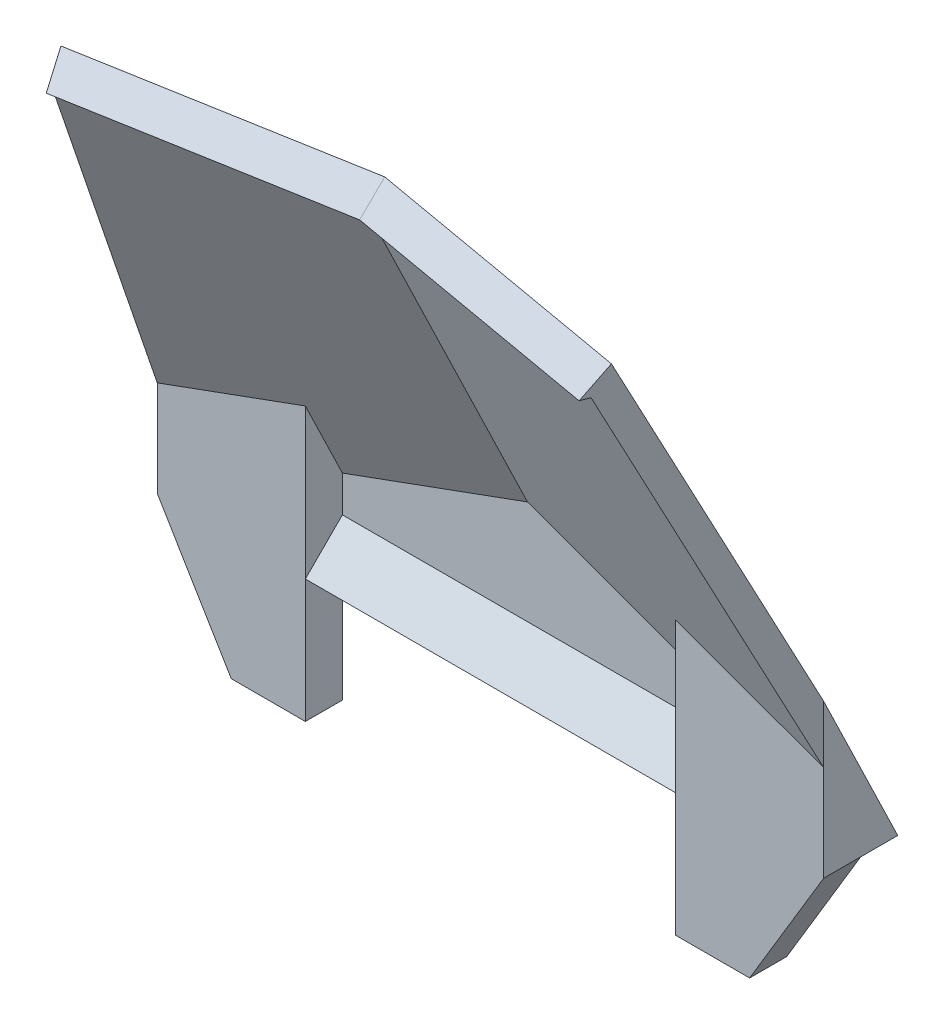
ISO-10303-21;
HEADER;
FILE_DESCRIPTION(('STEP AP214'),'2;1');
FILE_NAME('part.step','',(''),(''),'','','');
FILE_SCHEMA(('AUTOMOTIVE_DESIGN { 1 0 10303 214 1 1 1 1 }'));
ENDSEC;
DATA;
#1=APPLICATION_CONTEXT('core data for automotive mechanical design processes');
#2=APPLICATION_PROTOCOL_DEFINITION('international standard','automotive_design',2000,#1);
#3=PRODUCT_CONTEXT('',#1,'mechanical');
#4=PRODUCT('Part','Part','',(#3));
#5=PRODUCT_RELATED_PRODUCT_CATEGORY('part','',(#4));
#6=PRODUCT_DEFINITION_FORMATION('','',#4);
#7=PRODUCT_DEFINITION_CONTEXT('part definition',#1,'design');
#8=PRODUCT_DEFINITION('design','',#6,#7);
#9=PRODUCT_DEFINITION_SHAPE('','',#8);
#10=(LENGTH_UNIT() NAMED_UNIT(*) SI_UNIT(.MILLI.,.METRE.));
#11=(NAMED_UNIT(*) PLANE_ANGLE_UNIT() SI_UNIT($,.RADIAN.));
#12=(NAMED_UNIT(*) SI_UNIT($,.STERADIAN.) SOLID_ANGLE_UNIT());
#13=UNCERTAINTY_MEASURE_WITH_UNIT(LENGTH_MEASURE(1.E-05),#10,'distance_accuracy_value','');
#14=(GEOMETRIC_REPRESENTATION_CONTEXT(3) GLOBAL_UNCERTAINTY_ASSIGNED_CONTEXT((#13)) GLOBAL_UNIT_ASSIGNED_CONTEXT((#10,
#11,#12)) REPRESENTATION_CONTEXT('',''));
#15=CARTESIAN_POINT('',(0.,0.,0.));
#16=DIRECTION('',(0.,0.,1.));
#17=DIRECTION('',(1.,0.,0.));
#18=AXIS2_PLACEMENT_3D('',#15,#16,#17);
#19=CARTESIAN_POINT('',(-27.,40.002,6.));
#20=DIRECTION('',(0.,0.,1.));
#21=DIRECTION('',(1.,0.,0.));
#22=AXIS2_PLACEMENT_3D('',#19,#20,#21);
#23=PLANE('',#22);
#24=DIRECTION('',(0.,-1.,0.));
#25=VECTOR('',#24,1.);
#26=CARTESIAN_POINT('',(-15.,40.002,6.));
#27=LINE('',#26,#25);
#28=CARTESIAN_POINT('',(-15.,0.,6.));
#29=VERTEX_POINT('',#28);
#30=CARTESIAN_POINT('',(-15.,-10.,6.));
#31=VERTEX_POINT('',#30);
#32=EDGE_CURVE('E197',#29,#31,#27,.T.);
#33=ORIENTED_EDGE('',*,*,#32,.F.);
#34=CARTESIAN_POINT('',(-15.,12.1402864437604,6.));
#35=VERTEX_POINT('',#34);
#36=EDGE_CURVE('E184',#35,#29,#27,.T.);
#37=ORIENTED_EDGE('',*,*,#36,.F.);
#38=DIRECTION('',(0.939418830860334,0.342771440211991,0.));
#39=VECTOR('',#38,1.);
#40=CARTESIAN_POINT('',(-16.6184554571336,11.5497507958294,6.));
#41=LINE('',#40,#39);
#42=CARTESIAN_POINT('',(-27.,7.76177374269293,6.));
#43=VERTEX_POINT('',#42);
#44=EDGE_CURVE('E261',#43,#35,#41,.T.);
#45=ORIENTED_EDGE('',*,*,#44,.F.);
#46=DIRECTION('',(0.,-1.,0.));
#47=VECTOR('',#46,1.);
#48=CARTESIAN_POINT('',(-27.,40.002,6.));
#49=LINE('',#48,#47);
#50=CARTESIAN_POINT('',(-27.,0.,6.));
#51=VERTEX_POINT('',#50);
#52=EDGE_CURVE('E264',#43,#51,#49,.T.);
#53=ORIENTED_EDGE('',*,*,#52,.T.);
#54=DIRECTION('',(0.514495755427526,-0.857492925712545,0.));
#55=VECTOR('',#54,1.);
#56=CARTESIAN_POINT('',(-21.,-10.,6.));
#57=LINE('',#56,#55);
#58=CARTESIAN_POINT('',(-21.,-10.,6.));
#59=VERTEX_POINT('',#58);
#60=EDGE_CURVE('E204',#51,#59,#57,.T.);
#61=ORIENTED_EDGE('',*,*,#60,.T.);
#62=DIRECTION('',(-1.,0.,0.));
#63=VECTOR('',#62,1.);
#64=CARTESIAN_POINT('',(-27.,-10.,6.));
#65=LINE('',#64,#63);
#66=EDGE_CURVE('E259',#31,#59,#65,.T.);
#67=ORIENTED_EDGE('',*,*,#66,.F.);
#68=EDGE_LOOP('',(#33,#37,#45,#53,#61,#67));
#69=FACE_BOUND('',#68,.T.);
#70=ADVANCED_FACE('F44',(#69),#23,.T.);
#71=CARTESIAN_POINT('',(-27.,40.,3.));
#72=DIRECTION('',(0.,0.,1.));
#73=DIRECTION('',(1.,0.,0.));
#74=AXIS2_PLACEMENT_3D('',#71,#72,#73);
#75=PLANE('',#74);
#76=DIRECTION('',(0.,-1.,0.));
#77=VECTOR('',#76,1.);
#78=CARTESIAN_POINT('',(-15.,40.002,3.));
#79=LINE('',#78,#77);
#80=CARTESIAN_POINT('',(-15.,5.93234157412782,3.));
#81=VERTEX_POINT('',#80);
#82=CARTESIAN_POINT('',(-15.,3.,3.));
#83=VERTEX_POINT('',#82);
#84=EDGE_CURVE('E182',#81,#83,#79,.T.);
#85=ORIENTED_EDGE('',*,*,#84,.T.);
#86=DIRECTION('',(1.,0.,0.));
#87=VECTOR('',#86,1.);
#88=CARTESIAN_POINT('',(-15.,3.,3.));
#89=LINE('',#88,#87);
#90=CARTESIAN_POINT('',(15.,3.,3.));
#91=VERTEX_POINT('',#90);
#92=EDGE_CURVE('E193',#83,#91,#89,.T.);
#93=ORIENTED_EDGE('',*,*,#92,.T.);
#94=DIRECTION('',(0.,-1.,0.));
#95=VECTOR('',#94,1.);
#96=CARTESIAN_POINT('',(15.,40.002,3.));
#97=LINE('',#96,#95);
#98=CARTESIAN_POINT('',(15.,5.9323415741281,3.));
#99=VERTEX_POINT('',#98);
#100=EDGE_CURVE('E240',#99,#91,#97,.T.);
#101=ORIENTED_EDGE('',*,*,#100,.F.);
#102=DIRECTION('',(0.939418830860325,-0.342771440212016,0.));
#103=VECTOR('',#102,1.);
#104=CARTESIAN_POINT('',(-33.0353136369046,23.4592774790415,3.));
#105=LINE('',#104,#103);
#106=CARTESIAN_POINT('',(9.8616686572869E-13,11.4054824504625,3.));
#107=VERTEX_POINT('',#106);
#108=EDGE_CURVE('E277',#107,#99,#105,.T.);
#109=ORIENTED_EDGE('',*,*,#108,.F.);
#110=DIRECTION('',(0.939418830860334,0.342771440211991,0.));
#111=VECTOR('',#110,1.);
#112=CARTESIAN_POINT('',(-14.6201043109452,6.07095641576175,3.));
#113=LINE('',#112,#111);
#114=EDGE_CURVE('E196',#81,#107,#113,.T.);
#115=ORIENTED_EDGE('',*,*,#114,.F.);
#116=EDGE_LOOP('',(#85,#93,#101,#109,#115));
#117=FACE_BOUND('',#116,.T.);
#118=ADVANCED_FACE('F192',(#117),#75,.T.);
#119=CARTESIAN_POINT('',(-15.,40.002,3.));
#120=DIRECTION('',(1.,0.,0.));
#121=DIRECTION('',(0.,0.,-1.));
#122=AXIS2_PLACEMENT_3D('',#119,#120,#121);
#123=PLANE('',#122);
#124=ORIENTED_EDGE('',*,*,#36,.T.);
#125=DIRECTION('',(0.,0.707106781186547,-0.707106781186548));
#126=VECTOR('',#125,1.);
#127=CARTESIAN_POINT('',(-15.,0.,6.));
#128=LINE('',#127,#126);
#129=EDGE_CURVE('E53',#29,#83,#128,.T.);
#130=ORIENTED_EDGE('',*,*,#129,.T.);
#131=ORIENTED_EDGE('',*,*,#84,.F.);
#132=DIRECTION('',(0.,-0.900377743752504,-0.43510908810912));
#133=VECTOR('',#132,1.);
#134=CARTESIAN_POINT('',(-15.,33.5519350416121,16.3472158890736));
#135=LINE('',#134,#133);
#136=EDGE_CURVE('E268',#35,#81,#135,.T.);
#137=ORIENTED_EDGE('',*,*,#136,.F.);
#138=EDGE_LOOP('',(#124,#130,#131,#137));
#139=FACE_BOUND('',#138,.T.);
#140=ADVANCED_FACE('F180',(#139),#123,.T.);
#141=CARTESIAN_POINT('',(15.,40.002,6.));
#142=DIRECTION('',(-1.,0.,0.));
#143=DIRECTION('',(0.,0.,1.));
#144=AXIS2_PLACEMENT_3D('',#141,#142,#143);
#145=PLANE('',#144);
#146=ORIENTED_EDGE('',*,*,#100,.T.);
#147=DIRECTION('',(0.,-0.707106781186547,0.707106781186548));
#148=VECTOR('',#147,1.);
#149=CARTESIAN_POINT('',(15.,0.,6.));
#150=LINE('',#149,#148);
#151=CARTESIAN_POINT('',(15.,0.,6.));
#152=VERTEX_POINT('',#151);
#153=EDGE_CURVE('E11',#91,#152,#150,.T.);
#154=ORIENTED_EDGE('',*,*,#153,.T.);
#155=DIRECTION('',(0.,-1.,0.));
#156=VECTOR('',#155,1.);
#157=CARTESIAN_POINT('',(15.,40.002,6.));
#158=LINE('',#157,#156);
#159=CARTESIAN_POINT('',(15.,12.1402864437605,6.));
#160=VERTEX_POINT('',#159);
#161=EDGE_CURVE('E60',#160,#152,#158,.T.);
#162=ORIENTED_EDGE('',*,*,#161,.F.);
#163=DIRECTION('',(0.,0.9003777437525,0.435109088109129));
#164=VECTOR('',#163,1.);
#165=CARTESIAN_POINT('',(15.,34.7272226587256,16.9151756447392));
#166=LINE('',#165,#164);
#167=EDGE_CURVE('E233',#99,#160,#166,.T.);
#168=ORIENTED_EDGE('',*,*,#167,.F.);
#169=EDGE_LOOP('',(#146,#154,#162,#168));
#170=FACE_BOUND('',#169,.T.);
#171=ADVANCED_FACE('F432',(#170),#145,.T.);
#172=CARTESIAN_POINT('',(27.,40.,6.));
#173=DIRECTION('',(-0.93611119169746,0.,-0.351704189310792));
#174=DIRECTION('',(-0.351704189310792,0.,0.93611119169746));
#175=AXIS2_PLACEMENT_3D('',#172,#173,#174);
#176=PLANE('',#175);
#177=DIRECTION('',(-0.153262470206926,0.900057595595595,0.407930067335993));
#178=VECTOR('',#177,1.);
#179=CARTESIAN_POINT('',(23.1949085190303,34.7618788438307,16.1277972484448));
#180=LINE('',#179,#178);
#181=CARTESIAN_POINT('',(27.,12.4158897392648,6.));
#182=VERTEX_POINT('',#181);
#183=CARTESIAN_POINT('',(22.3029573910512,40.,18.5018532270917));
#184=VERTEX_POINT('',#183);
#185=EDGE_CURVE('E314',#182,#184,#180,.T.);
#186=ORIENTED_EDGE('',*,*,#185,.T.);
#187=DIRECTION('',(0.250819929138987,0.701005432040211,-0.667593249963501));
#188=VECTOR('',#187,1.);
#189=CARTESIAN_POINT('',(21.4751838728926,37.6864927172247,20.7050912836459));
#190=LINE('',#189,#188);
#191=CARTESIAN_POINT('',(21.5873568616545,38.,20.4065267701213));
#192=VERTEX_POINT('',#191);
#193=EDGE_CURVE('E345',#184,#192,#190,.F.);
#194=ORIENTED_EDGE('',*,*,#193,.T.);
#195=DIRECTION('',(0.351704189310792,0.,-0.93611119169746));
#196=VECTOR('',#195,1.);
#197=CARTESIAN_POINT('',(25.6356177736577,38.,9.63149917075185));
#198=LINE('',#197,#196);
#199=CARTESIAN_POINT('',(21.8510125645858,38.,19.7047692654622));
#200=VERTEX_POINT('',#199);
#201=EDGE_CURVE('E295',#192,#200,#198,.T.);
#202=ORIENTED_EDGE('',*,*,#201,.T.);
#203=DIRECTION('',(-0.153262470206926,0.900057595595595,0.407930067335993));
#204=VECTOR('',#203,1.);
#205=CARTESIAN_POINT('',(22.5528962531785,33.8780793217699,17.8366050634688));
#206=LINE('',#205,#204);
#207=CARTESIAN_POINT('',(27.,7.76177374269269,6.));
#208=VERTEX_POINT('',#207);
#209=EDGE_CURVE('E280',#208,#200,#206,.T.);
#210=ORIENTED_EDGE('',*,*,#209,.F.);
#211=DIRECTION('',(0.,-1.,0.));
#212=VECTOR('',#211,1.);
#213=CARTESIAN_POINT('',(27.,40.,6.));
#214=LINE('',#213,#212);
#215=EDGE_CURVE('E337',#182,#208,#214,.T.);
#216=ORIENTED_EDGE('',*,*,#215,.F.);
#217=EDGE_LOOP('',(#186,#194,#202,#210,#216));
#218=FACE_BOUND('',#217,.T.);
#219=ADVANCED_FACE('F377',(#218),#176,.F.);
#220=CARTESIAN_POINT('',(27.,40.,0.));
#221=DIRECTION('',(-1.,0.,0.));
#222=DIRECTION('',(0.,0.,1.));
#223=AXIS2_PLACEMENT_3D('',#220,#221,#222);
#224=PLANE('',#223);
#225=DIRECTION('',(0.,-1.,0.));
#226=VECTOR('',#225,1.);
#227=CARTESIAN_POINT('',(27.,40.002,6.));
#228=LINE('',#227,#226);
#229=CARTESIAN_POINT('',(27.,0.,6.));
#230=VERTEX_POINT('',#229);
#231=EDGE_CURVE('E239',#208,#230,#228,.T.);
#232=ORIENTED_EDGE('',*,*,#231,.T.);
#233=DIRECTION('',(0.,0.,-1.));
#234=VECTOR('',#233,1.);
#235=CARTESIAN_POINT('',(27.,0.,17.6619037896906));
#236=LINE('',#235,#234);
#237=CARTESIAN_POINT('',(27.,0.,3.));
#238=VERTEX_POINT('',#237);
#239=EDGE_CURVE('E223',#230,#238,#236,.T.);
#240=ORIENTED_EDGE('',*,*,#239,.T.);
#241=DIRECTION('',(0.,0.,-1.));
#242=VECTOR('',#241,1.);
#243=CARTESIAN_POINT('',(27.,0.,0.));
#244=LINE('',#243,#242);
#245=CARTESIAN_POINT('',(27.,0.,0.));
#246=VERTEX_POINT('',#245);
#247=EDGE_CURVE('E326',#238,#246,#244,.T.);
#248=ORIENTED_EDGE('',*,*,#247,.T.);
#249=DIRECTION('',(0.,0.9003777437525,0.435109088109129));
#250=VECTOR('',#249,1.);
#251=CARTESIAN_POINT('',(27.,42.9226680678995,20.7424529224795));
#252=LINE('',#251,#250);
#253=EDGE_CURVE('E288',#246,#182,#252,.T.);
#254=ORIENTED_EDGE('',*,*,#253,.T.);
#255=ORIENTED_EDGE('',*,*,#215,.T.);
#256=EDGE_LOOP('',(#232,#240,#248,#254,#255));
#257=FACE_BOUND('',#256,.T.);
#258=ADVANCED_FACE('F659',(#257),#224,.F.);
#259=CARTESIAN_POINT('',(-27.,40.,0.));
#260=DIRECTION('',(1.,0.,0.));
#261=DIRECTION('',(0.,0.,-1.));
#262=AXIS2_PLACEMENT_3D('',#259,#260,#261);
#263=PLANE('',#262);
#264=DIRECTION('',(0.,0.,1.));
#265=VECTOR('',#264,1.);
#266=CARTESIAN_POINT('',(-27.,0.,0.));
#267=LINE('',#266,#265);
#268=CARTESIAN_POINT('',(-27.,0.,0.));
#269=VERTEX_POINT('',#268);
#270=CARTESIAN_POINT('',(-27.,0.,3.00000000000001));
#271=VERTEX_POINT('',#270);
#272=EDGE_CURVE('E331',#269,#271,#267,.T.);
#273=ORIENTED_EDGE('',*,*,#272,.T.);
#274=DIRECTION('',(0.,0.,-1.));
#275=VECTOR('',#274,1.);
#276=CARTESIAN_POINT('',(-27.,0.,17.6619037896906));
#277=LINE('',#276,#275);
#278=EDGE_CURVE('E228',#51,#271,#277,.T.);
#279=ORIENTED_EDGE('',*,*,#278,.F.);
#280=ORIENTED_EDGE('',*,*,#52,.F.);
#281=DIRECTION('',(0.,-1.,0.));
#282=VECTOR('',#281,1.);
#283=CARTESIAN_POINT('',(-27.,40.,6.));
#284=LINE('',#283,#282);
#285=CARTESIAN_POINT('',(-27.,12.4158897392651,6.));
#286=VERTEX_POINT('',#285);
#287=EDGE_CURVE('E334',#286,#43,#284,.T.);
#288=ORIENTED_EDGE('',*,*,#287,.F.);
#289=DIRECTION('',(0.,-0.900377743752504,-0.43510908810912));
#290=VECTOR('',#289,1.);
#291=CARTESIAN_POINT('',(-27.,42.9226680678991,20.7424529224788));
#292=LINE('',#291,#290);
#293=EDGE_CURVE('E317',#286,#269,#292,.T.);
#294=ORIENTED_EDGE('',*,*,#293,.T.);
#295=EDGE_LOOP('',(#273,#279,#280,#288,#294));
#296=FACE_BOUND('',#295,.T.);
#297=ADVANCED_FACE('F385',(#296),#263,.F.);
#298=CARTESIAN_POINT('',(0.,0.,0.));
#299=DIRECTION('',(0.,-1.,0.));
#300=DIRECTION('',(0.,0.,-1.));
#301=AXIS2_PLACEMENT_3D('',#298,#299,#300);
#302=PLANE('',#301);
#303=ORIENTED_EDGE('',*,*,#247,.F.);
#304=DIRECTION('',(-1.,0.,0.));
#305=VECTOR('',#304,1.);
#306=CARTESIAN_POINT('',(0.,0.,3.));
#307=LINE('',#306,#305);
#308=CARTESIAN_POINT('',(15.,0.,3.));
#309=VERTEX_POINT('',#308);
#310=EDGE_CURVE('E275',#238,#309,#307,.T.);
#311=ORIENTED_EDGE('',*,*,#310,.T.);
#312=DIRECTION('',(0.,0.,1.));
#313=VECTOR('',#312,1.);
#314=CARTESIAN_POINT('',(15.,0.,3.));
#315=LINE('',#314,#313);
#316=EDGE_CURVE('E202',#309,#152,#315,.T.);
#317=ORIENTED_EDGE('',*,*,#316,.T.);
#318=DIRECTION('',(-1.,0.,0.));
#319=VECTOR('',#318,1.);
#320=CARTESIAN_POINT('',(15.,0.,6.));
#321=LINE('',#320,#319);
#322=EDGE_CURVE('E213',#152,#29,#321,.T.);
#323=ORIENTED_EDGE('',*,*,#322,.T.);
#324=DIRECTION('',(0.,0.,-1.));
#325=VECTOR('',#324,1.);
#326=CARTESIAN_POINT('',(-15.,0.,6.));
#327=LINE('',#326,#325);
#328=CARTESIAN_POINT('',(-15.,0.,3.));
#329=VERTEX_POINT('',#328);
#330=EDGE_CURVE('E207',#29,#329,#327,.T.);
#331=ORIENTED_EDGE('',*,*,#330,.T.);
#332=DIRECTION('',(1.,0.,0.));
#333=VECTOR('',#332,1.);
#334=CARTESIAN_POINT('',(0.,0.,3.));
#335=LINE('',#334,#333);
#336=EDGE_CURVE('E267',#271,#329,#335,.T.);
#337=ORIENTED_EDGE('',*,*,#336,.F.);
#338=ORIENTED_EDGE('',*,*,#272,.F.);
#339=DIRECTION('',(-1.,0.,0.));
#340=VECTOR('',#339,1.);
#341=CARTESIAN_POINT('',(-27.,0.,0.));
#342=LINE('',#341,#340);
#343=EDGE_CURVE('E328',#246,#269,#342,.T.);
#344=ORIENTED_EDGE('',*,*,#343,.F.);
#345=EDGE_LOOP('',(#303,#311,#317,#323,#331,#337,#338,#344));
#346=FACE_BOUND('',#345,.T.);
#347=ADVANCED_FACE('F405',(#346),#302,.T.);
#348=CARTESIAN_POINT('',(-27.,40.,0.));
#349=DIRECTION('',(0.,0.,1.));
#350=DIRECTION('',(1.,0.,0.));
#351=AXIS2_PLACEMENT_3D('',#348,#349,#350);
#352=PLANE('',#351);
#353=DIRECTION('',(0.939418830860334,0.342771440211991,0.));
#354=VECTOR('',#353,1.);
#355=CARTESIAN_POINT('',(-14.1197621753495,4.6996904090001,0.));
#356=LINE('',#355,#354);
#357=CARTESIAN_POINT('',(1.08133268868649E-12,9.85165357740212,0.));
#358=VERTEX_POINT('',#357);
#359=EDGE_CURVE('E323',#269,#358,#356,.T.);
#360=ORIENTED_EDGE('',*,*,#359,.T.);
#361=DIRECTION('',(0.939418830860325,-0.342771440212016,0.));
#362=VECTOR('',#361,1.);
#363=CARTESIAN_POINT('',(-33.5356557725002,22.08801147228,0.));
#364=LINE('',#363,#362);
#365=EDGE_CURVE('E311',#358,#246,#364,.T.);
#366=ORIENTED_EDGE('',*,*,#365,.T.);
#367=ORIENTED_EDGE('',*,*,#343,.T.);
#368=EDGE_LOOP('',(#360,#366,#367));
#369=FACE_BOUND('',#368,.T.);
#370=ADVANCED_FACE('F590',(#369),#352,.F.);
#371=CARTESIAN_POINT('',(-27.,40.,6.));
#372=DIRECTION('',(0.936111191697411,0.,-0.351704189310923));
#373=DIRECTION('',(-0.351704189310923,0.,-0.936111191697411));
#374=AXIS2_PLACEMENT_3D('',#371,#372,#373);
#375=PLANE('',#374);
#376=DIRECTION('',(0.351704189310923,0.,0.936111191697411));
#377=VECTOR('',#376,1.);
#378=CARTESIAN_POINT('',(-25.6356177736559,38.,9.63149917075525));
#379=LINE('',#378,#377);
#380=CARTESIAN_POINT('',(-21.8510125645839,38.,19.7047692654615));
#381=VERTEX_POINT('',#380);
#382=CARTESIAN_POINT('',(-21.5873568616524,38.,20.4065267701205));
#383=VERTEX_POINT('',#382);
#384=EDGE_CURVE('E285',#381,#383,#379,.T.);
#385=ORIENTED_EDGE('',*,*,#384,.T.);
#386=DIRECTION('',(0.250819929139084,-0.701005432040201,0.667593249963475));
#387=VECTOR('',#386,1.);
#388=CARTESIAN_POINT('',(-21.4751838728899,37.6864927172229,20.7050912836468));
#389=LINE('',#388,#387);
#390=CARTESIAN_POINT('',(-22.3029573910495,40.,18.5018532270909));
#391=VERTEX_POINT('',#390);
#392=EDGE_CURVE('E189',#383,#391,#389,.F.);
#393=ORIENTED_EDGE('',*,*,#392,.T.);
#394=DIRECTION('',(-0.153262470206984,-0.900057595595594,-0.407930067335973));
#395=VECTOR('',#394,1.);
#396=CARTESIAN_POINT('',(-23.1949085190289,34.7618788438307,16.1277972484442));
#397=LINE('',#396,#395);
#398=EDGE_CURVE('E320',#391,#286,#397,.T.);
#399=ORIENTED_EDGE('',*,*,#398,.T.);
#400=ORIENTED_EDGE('',*,*,#287,.T.);
#401=DIRECTION('',(-0.153262470206984,-0.900057595595594,-0.407930067335973));
#402=VECTOR('',#401,1.);
#403=CARTESIAN_POINT('',(-22.5528962531769,33.8780793217699,17.8366050634681));
#404=LINE('',#403,#402);
#405=EDGE_CURVE('E276',#381,#43,#404,.T.);
#406=ORIENTED_EDGE('',*,*,#405,.F.);
#407=EDGE_LOOP('',(#385,#393,#399,#400,#406));
#408=FACE_BOUND('',#407,.T.);
#409=ADVANCED_FACE('F364',(#408),#375,.F.);
#410=CARTESIAN_POINT('',(72.6151290925195,40.,1.76523362281912));
#411=DIRECTION('',(0.156797148455699,-0.429727149360487,0.889240817404752));
#412=DIRECTION('',(0.,-0.900377743752504,-0.43510908810912));
#413=AXIS2_PLACEMENT_3D('',#410,#411,#412);
#414=PLANE('',#413);
#415=DIRECTION('',(-0.98480775301221,0.,0.173648177666922));
#416=VECTOR('',#415,1.);
#417=CARTESIAN_POINT('',(2.49148679177111,40.,14.1299237459899));
#418=LINE('',#417,#416);
#419=CARTESIAN_POINT('',(0.,40.,14.5692400894578));
#420=VERTEX_POINT('',#419);
#421=EDGE_CURVE('E339',#420,#391,#418,.T.);
#422=ORIENTED_EDGE('',*,*,#421,.F.);
#423=DIRECTION('',(0.,-0.900377743752502,-0.435109088109125));
#424=VECTOR('',#423,1.);
#425=CARTESIAN_POINT('',(1.94289029309402E-13,34.9838699167698,12.1451866280131));
#426=LINE('',#425,#424);
#427=EDGE_CURVE('E342',#420,#358,#426,.T.);
#428=ORIENTED_EDGE('',*,*,#427,.T.);
#429=ORIENTED_EDGE('',*,*,#359,.F.);
#430=ORIENTED_EDGE('',*,*,#293,.F.);
#431=ORIENTED_EDGE('',*,*,#398,.F.);
#432=EDGE_LOOP('',(#422,#428,#429,#430,#431));
#433=FACE_BOUND('',#432,.T.);
#434=ADVANCED_FACE('F382',(#433),#414,.F.);
#435=CARTESIAN_POINT('',(-72.6151290925198,40.,1.76523362281768));
#436=DIRECTION('',(-0.156797148455715,-0.429727149360494,0.889240817404745));
#437=DIRECTION('',(0.,-0.9003777437525,-0.435109088109129));
#438=AXIS2_PLACEMENT_3D('',#435,#436,#437);
#439=PLANE('',#438);
#440=ORIENTED_EDGE('',*,*,#253,.F.);
#441=ORIENTED_EDGE('',*,*,#365,.F.);
#442=ORIENTED_EDGE('',*,*,#427,.F.);
#443=DIRECTION('',(0.984807753012206,0.,0.17364817766694));
#444=VECTOR('',#443,1.);
#445=CARTESIAN_POINT('',(-72.6151290925198,40.,1.76523362281768));
#446=LINE('',#445,#444);
#447=EDGE_CURVE('E308',#420,#184,#446,.T.);
#448=ORIENTED_EDGE('',*,*,#447,.T.);
#449=ORIENTED_EDGE('',*,*,#185,.F.);
#450=EDGE_LOOP('',(#440,#441,#442,#448,#449));
#451=FACE_BOUND('',#450,.T.);
#452=ADVANCED_FACE('F380',(#451),#439,.F.);
#453=CARTESIAN_POINT('',(0.,38.,0.));
#454=DIRECTION('',(0.,-1.,0.));
#455=DIRECTION('',(0.,0.,-1.));
#456=AXIS2_PLACEMENT_3D('',#453,#454,#455);
#457=PLANE('',#456);
#458=ORIENTED_EDGE('',*,*,#201,.F.);
#459=DIRECTION('',(0.984807753012206,0.,0.17364817766694));
#460=VECTOR('',#459,1.);
#461=CARTESIAN_POINT('',(-2.83878314710524,38.,16.0995392520142));
#462=LINE('',#461,#460);
#463=CARTESIAN_POINT('',(0.,38.,16.6000933132293));
#464=VERTEX_POINT('',#463);
#465=EDGE_CURVE('E298',#464,#192,#462,.T.);
#466=ORIENTED_EDGE('',*,*,#465,.F.);
#467=DIRECTION('',(0.98480775301221,0.,-0.173648177666922));
#468=VECTOR('',#467,1.);
#469=CARTESIAN_POINT('',(2.83878314710495,38.,16.0995392520143));
#470=LINE('',#469,#468);
#471=EDGE_CURVE('E292',#383,#464,#470,.T.);
#472=ORIENTED_EDGE('',*,*,#471,.F.);
#473=ORIENTED_EDGE('',*,*,#384,.F.);
#474=DIRECTION('',(-0.98480775301221,0.,0.173648177666922));
#475=VECTOR('',#474,1.);
#476=CARTESIAN_POINT('',(2.71082535371397,38.,15.3738545446776));
#477=LINE('',#476,#475);
#478=CARTESIAN_POINT('',(0.,38.,15.8518461945259));
#479=VERTEX_POINT('',#478);
#480=EDGE_CURVE('E282',#479,#381,#477,.T.);
#481=ORIENTED_EDGE('',*,*,#480,.F.);
#482=DIRECTION('',(0.984807753012206,0.,0.17364817766694));
#483=VECTOR('',#482,1.);
#484=CARTESIAN_POINT('',(-72.8344676544627,38.,3.00916442150538));
#485=LINE('',#484,#483);
#486=EDGE_CURVE('E281',#479,#200,#485,.T.);
#487=ORIENTED_EDGE('',*,*,#486,.T.);
#488=EDGE_LOOP('',(#458,#466,#472,#473,#481,#487));
#489=FACE_BOUND('',#488,.T.);
#490=ADVANCED_FACE('F360',(#489),#457,.T.);
#491=CARTESIAN_POINT('',(72.9287233894309,39.140545701279,3.54371525762862));
#492=DIRECTION('',(0.156797148455699,-0.429727149360487,0.889240817404752));
#493=DIRECTION('',(0.,-0.900377743752504,-0.43510908810912));
#494=AXIS2_PLACEMENT_3D('',#491,#492,#493);
#495=PLANE('',#494);
#496=ORIENTED_EDGE('',*,*,#44,.T.);
#497=ORIENTED_EDGE('',*,*,#136,.T.);
#498=ORIENTED_EDGE('',*,*,#114,.T.);
#499=DIRECTION('',(0.,-0.900377743752502,-0.435109088109125));
#500=VECTOR('',#499,1.);
#501=CARTESIAN_POINT('',(1.66533453693773E-13,34.1027530553525,13.9684949278072));
#502=LINE('',#501,#500);
#503=EDGE_CURVE('E284',#479,#107,#502,.T.);
#504=ORIENTED_EDGE('',*,*,#503,.F.);
#505=ORIENTED_EDGE('',*,*,#480,.T.);
#506=ORIENTED_EDGE('',*,*,#405,.T.);
#507=EDGE_LOOP('',(#496,#497,#498,#504,#505,#506));
#508=FACE_BOUND('',#507,.T.);
#509=ADVANCED_FACE('F369',(#508),#495,.T.);
#510=CARTESIAN_POINT('',(-72.9287233894312,39.140545701279,3.54371525762717));
#511=DIRECTION('',(-0.156797148455715,-0.429727149360494,0.889240817404745));
#512=DIRECTION('',(0.,-0.9003777437525,-0.435109088109129));
#513=AXIS2_PLACEMENT_3D('',#510,#511,#512);
#514=PLANE('',#513);
#515=ORIENTED_EDGE('',*,*,#167,.T.);
#516=DIRECTION('',(0.939418830860325,-0.342771440212016,0.));
#517=VECTOR('',#516,1.);
#518=CARTESIAN_POINT('',(6.02836257983311,15.4138221432251,6.));
#519=LINE('',#518,#517);
#520=EDGE_CURVE('E236',#160,#208,#519,.T.);
#521=ORIENTED_EDGE('',*,*,#520,.T.);
#522=ORIENTED_EDGE('',*,*,#209,.T.);
#523=ORIENTED_EDGE('',*,*,#486,.F.);
#524=ORIENTED_EDGE('',*,*,#503,.T.);
#525=ORIENTED_EDGE('',*,*,#108,.T.);
#526=EDGE_LOOP('',(#515,#521,#522,#523,#524,#525));
#527=FACE_BOUND('',#526,.T.);
#528=ADVANCED_FACE('F373',(#527),#514,.T.);
#529=CARTESIAN_POINT('',(2.49148679177111,40.,14.1299237459899));
#530=DIRECTION('',(-0.122787803968967,-0.707106781186545,-0.696364240320022));
#531=DIRECTION('',(0.98480775301221,0.,-0.173648177666922));
#532=AXIS2_PLACEMENT_3D('',#529,#530,#531);
#533=PLANE('',#532);
#534=ORIENTED_EDGE('',*,*,#392,.F.);
#535=ORIENTED_EDGE('',*,*,#471,.T.);
#536=DIRECTION('',(0.,0.701673843159865,-0.712498293208668));
#537=VECTOR('',#536,1.);
#538=CARTESIAN_POINT('',(0.,40.2196324346675,14.3462194704633));
#539=LINE('',#538,#537);
#540=EDGE_CURVE('E273',#420,#464,#539,.F.);
#541=ORIENTED_EDGE('',*,*,#540,.F.);
#542=ORIENTED_EDGE('',*,*,#421,.T.);
#543=EDGE_LOOP('',(#534,#535,#541,#542));
#544=FACE_BOUND('',#543,.T.);
#545=ADVANCED_FACE('F355',(#544),#533,.F.);
#546=CARTESIAN_POINT('',(-2.49148679177136,40.,14.1299237459898));
#547=DIRECTION('',(0.12278780396898,-0.707106781186546,-0.696364240320019));
#548=DIRECTION('',(0.984807753012206,0.,0.17364817766694));
#549=AXIS2_PLACEMENT_3D('',#546,#547,#548);
#550=PLANE('',#549);
#551=ORIENTED_EDGE('',*,*,#540,.T.);
#552=ORIENTED_EDGE('',*,*,#465,.T.);
#553=ORIENTED_EDGE('',*,*,#193,.F.);
#554=ORIENTED_EDGE('',*,*,#447,.F.);
#555=EDGE_LOOP('',(#551,#552,#553,#554));
#556=FACE_BOUND('',#555,.T.);
#557=ADVANCED_FACE('F352',(#556),#550,.F.);
#558=CARTESIAN_POINT('',(-27.,40.002,3.));
#559=DIRECTION('',(0.,0.,-1.));
#560=DIRECTION('',(-1.,0.,0.));
#561=AXIS2_PLACEMENT_3D('',#558,#559,#560);
#562=PLANE('',#561);
#563=CARTESIAN_POINT('',(-19.,-4.5,3.00000000000001));
#564=DIRECTION('',(0.,0.,-1.));
#565=DIRECTION('',(-1.,0.,0.));
#566=AXIS2_PLACEMENT_3D('',#563,#564,#565);
#567=CIRCLE('',#566,2.);
#568=CARTESIAN_POINT('',(-21.,-4.5,3.00000000000001));
#569=VERTEX_POINT('',#568);
#570=EDGE_CURVE('E488',#569,#569,#567,.T.);
#571=ORIENTED_EDGE('',*,*,#570,.F.);
#572=EDGE_LOOP('',(#571));
#573=FACE_BOUND('',#572,.T.);
#574=DIRECTION('',(0.514495755427526,-0.857492925712544,0.));
#575=VECTOR('',#574,1.);
#576=CARTESIAN_POINT('',(-21.,-10.,3.00000000000001));
#577=LINE('',#576,#575);
#578=CARTESIAN_POINT('',(-21.,-10.,3.));
#579=VERTEX_POINT('',#578);
#580=EDGE_CURVE('E67',#271,#579,#577,.T.);
#581=ORIENTED_EDGE('',*,*,#580,.F.);
#582=ORIENTED_EDGE('',*,*,#336,.T.);
#583=CARTESIAN_POINT('',(-15.,-10.,3.));
#584=VERTEX_POINT('',#583);
#585=EDGE_CURVE('E198',#329,#584,#79,.T.);
#586=ORIENTED_EDGE('',*,*,#585,.T.);
#587=DIRECTION('',(1.,0.,0.));
#588=VECTOR('',#587,1.);
#589=CARTESIAN_POINT('',(-27.,-10.,3.));
#590=LINE('',#589,#588);
#591=EDGE_CURVE('E254',#579,#584,#590,.T.);
#592=ORIENTED_EDGE('',*,*,#591,.F.);
#593=EDGE_LOOP('',(#581,#582,#586,#592));
#594=FACE_BOUND('',#593,.T.);
#595=ADVANCED_FACE('F400',(#573,#594),#562,.T.);
#596=ORIENTED_EDGE('',*,*,#161,.T.);
#597=CARTESIAN_POINT('',(15.,-10.,6.));
#598=VERTEX_POINT('',#597);
#599=EDGE_CURVE('E242',#152,#598,#158,.T.);
#600=ORIENTED_EDGE('',*,*,#599,.T.);
#601=DIRECTION('',(-1.,0.,0.));
#602=VECTOR('',#601,1.);
#603=CARTESIAN_POINT('',(15.,-10.,6.));
#604=LINE('',#603,#602);
#605=CARTESIAN_POINT('',(21.,-10.,6.));
#606=VERTEX_POINT('',#605);
#607=EDGE_CURVE('E251',#606,#598,#604,.T.);
#608=ORIENTED_EDGE('',*,*,#607,.F.);
#609=DIRECTION('',(0.514495755427527,0.857492925712544,0.));
#610=VECTOR('',#609,1.);
#611=CARTESIAN_POINT('',(27.,0.,6.));
#612=LINE('',#611,#610);
#613=EDGE_CURVE('E220',#606,#230,#612,.T.);
#614=ORIENTED_EDGE('',*,*,#613,.T.);
#615=ORIENTED_EDGE('',*,*,#231,.F.);
#616=ORIENTED_EDGE('',*,*,#520,.F.);
#617=EDGE_LOOP('',(#596,#600,#608,#614,#615,#616));
#618=FACE_BOUND('',#617,.T.);
#619=ADVANCED_FACE('F414',(#618),#23,.T.);
#620=ORIENTED_EDGE('',*,*,#330,.F.);
#621=ORIENTED_EDGE('',*,*,#32,.T.);
#622=DIRECTION('',(0.,0.,1.));
#623=VECTOR('',#622,1.);
#624=CARTESIAN_POINT('',(-15.,-10.,3.));
#625=LINE('',#624,#623);
#626=EDGE_CURVE('E256',#584,#31,#625,.T.);
#627=ORIENTED_EDGE('',*,*,#626,.F.);
#628=ORIENTED_EDGE('',*,*,#585,.F.);
#629=EDGE_LOOP('',(#620,#621,#627,#628));
#630=FACE_BOUND('',#629,.T.);
#631=ADVANCED_FACE('F393',(#630),#123,.T.);
#632=CARTESIAN_POINT('',(0.,-10.,0.));
#633=DIRECTION('',(0.,-1.,0.));
#634=DIRECTION('',(0.,0.,-1.));
#635=AXIS2_PLACEMENT_3D('',#632,#633,#634);
#636=PLANE('',#635);
#637=DIRECTION('',(0.,0.,-1.));
#638=VECTOR('',#637,1.);
#639=CARTESIAN_POINT('',(-21.,-10.,17.6619037896906));
#640=LINE('',#639,#638);
#641=EDGE_CURVE('E201',#59,#579,#640,.T.);
#642=ORIENTED_EDGE('',*,*,#641,.T.);
#643=ORIENTED_EDGE('',*,*,#591,.T.);
#644=ORIENTED_EDGE('',*,*,#626,.T.);
#645=ORIENTED_EDGE('',*,*,#66,.T.);
#646=EDGE_LOOP('',(#642,#643,#644,#645));
#647=FACE_BOUND('',#646,.T.);
#648=ADVANCED_FACE('F396',(#647),#636,.T.);
#649=CARTESIAN_POINT('',(15.,40.002,3.));
#650=DIRECTION('',(0.,0.,-1.));
#651=DIRECTION('',(-1.,0.,0.));
#652=AXIS2_PLACEMENT_3D('',#649,#650,#651);
#653=PLANE('',#652);
#654=CARTESIAN_POINT('',(19.,-4.5,3.));
#655=DIRECTION('',(0.,0.,-1.));
#656=DIRECTION('',(-1.,0.,0.));
#657=AXIS2_PLACEMENT_3D('',#654,#655,#656);
#658=CIRCLE('',#657,2.);
#659=CARTESIAN_POINT('',(17.,-4.5,3.));
#660=VERTEX_POINT('',#659);
#661=EDGE_CURVE('E485',#660,#660,#658,.T.);
#662=ORIENTED_EDGE('',*,*,#661,.F.);
#663=EDGE_LOOP('',(#662));
#664=FACE_BOUND('',#663,.T.);
#665=DIRECTION('',(0.514495755427527,0.857492925712544,0.));
#666=VECTOR('',#665,1.);
#667=CARTESIAN_POINT('',(27.,0.,3.));
#668=LINE('',#667,#666);
#669=CARTESIAN_POINT('',(21.,-10.,3.));
#670=VERTEX_POINT('',#669);
#671=EDGE_CURVE('E217',#670,#238,#668,.T.);
#672=ORIENTED_EDGE('',*,*,#671,.F.);
#673=DIRECTION('',(1.,0.,0.));
#674=VECTOR('',#673,1.);
#675=CARTESIAN_POINT('',(15.,-10.,3.));
#676=LINE('',#675,#674);
#677=CARTESIAN_POINT('',(15.,-10.,3.));
#678=VERTEX_POINT('',#677);
#679=EDGE_CURVE('E235',#678,#670,#676,.T.);
#680=ORIENTED_EDGE('',*,*,#679,.F.);
#681=EDGE_CURVE('E226',#309,#678,#97,.T.);
#682=ORIENTED_EDGE('',*,*,#681,.F.);
#683=ORIENTED_EDGE('',*,*,#310,.F.);
#684=EDGE_LOOP('',(#672,#680,#682,#683));
#685=FACE_BOUND('',#684,.T.);
#686=ADVANCED_FACE('F423',(#664,#685),#653,.T.);
#687=ORIENTED_EDGE('',*,*,#316,.F.);
#688=ORIENTED_EDGE('',*,*,#681,.T.);
#689=DIRECTION('',(0.,0.,-1.));
#690=VECTOR('',#689,1.);
#691=CARTESIAN_POINT('',(15.,-10.,6.));
#692=LINE('',#691,#690);
#693=EDGE_CURVE('E248',#598,#678,#692,.T.);
#694=ORIENTED_EDGE('',*,*,#693,.F.);
#695=ORIENTED_EDGE('',*,*,#599,.F.);
#696=EDGE_LOOP('',(#687,#688,#694,#695));
#697=FACE_BOUND('',#696,.T.);
#698=ADVANCED_FACE('F412',(#697),#145,.T.);
#699=CARTESIAN_POINT('',(0.,-10.,0.));
#700=DIRECTION('',(0.,1.,0.));
#701=DIRECTION('',(0.,0.,1.));
#702=AXIS2_PLACEMENT_3D('',#699,#700,#701);
#703=PLANE('',#702);
#704=ORIENTED_EDGE('',*,*,#679,.T.);
#705=DIRECTION('',(0.,0.,-1.));
#706=VECTOR('',#705,1.);
#707=CARTESIAN_POINT('',(21.,-10.,17.6619037896906));
#708=LINE('',#707,#706);
#709=EDGE_CURVE('E219',#606,#670,#708,.T.);
#710=ORIENTED_EDGE('',*,*,#709,.F.);
#711=ORIENTED_EDGE('',*,*,#607,.T.);
#712=ORIENTED_EDGE('',*,*,#693,.T.);
#713=EDGE_LOOP('',(#704,#710,#711,#712));
#714=FACE_BOUND('',#713,.T.);
#715=ADVANCED_FACE('F417',(#714),#703,.F.);
#716=CARTESIAN_POINT('',(27.,0.,17.6619037896906));
#717=DIRECTION('',(-0.857492925712544,0.514495755427527,0.));
#718=DIRECTION('',(-0.514495755427527,-0.857492925712544,0.));
#719=AXIS2_PLACEMENT_3D('',#716,#717,#718);
#720=PLANE('',#719);
#721=ORIENTED_EDGE('',*,*,#709,.T.);
#722=ORIENTED_EDGE('',*,*,#671,.T.);
#723=ORIENTED_EDGE('',*,*,#239,.F.);
#724=ORIENTED_EDGE('',*,*,#613,.F.);
#725=EDGE_LOOP('',(#721,#722,#723,#724));
#726=FACE_BOUND('',#725,.T.);
#727=ADVANCED_FACE('F421',(#726),#720,.F.);
#728=CARTESIAN_POINT('',(-21.,-10.,17.6619037896906));
#729=DIRECTION('',(0.857492925712544,0.514495755427526,0.));
#730=DIRECTION('',(-0.514495755427526,0.857492925712545,0.));
#731=AXIS2_PLACEMENT_3D('',#728,#729,#730);
#732=PLANE('',#731);
#733=ORIENTED_EDGE('',*,*,#278,.T.);
#734=ORIENTED_EDGE('',*,*,#580,.T.);
#735=ORIENTED_EDGE('',*,*,#641,.F.);
#736=ORIENTED_EDGE('',*,*,#60,.F.);
#737=EDGE_LOOP('',(#733,#734,#735,#736));
#738=FACE_BOUND('',#737,.T.);
#739=ADVANCED_FACE('F460',(#738),#732,.F.);
#740=CARTESIAN_POINT('',(-27.,0.,6.));
#741=DIRECTION('',(0.,0.707106781186548,0.707106781186547));
#742=DIRECTION('',(1.,0.,0.));
#743=AXIS2_PLACEMENT_3D('',#740,#741,#742);
#744=PLANE('',#743);
#745=ORIENTED_EDGE('',*,*,#153,.F.);
#746=ORIENTED_EDGE('',*,*,#92,.F.);
#747=ORIENTED_EDGE('',*,*,#129,.F.);
#748=ORIENTED_EDGE('',*,*,#322,.F.);
#749=EDGE_LOOP('',(#745,#746,#747,#748));
#750=FACE_BOUND('',#749,.T.);
#751=ADVANCED_FACE('F47',(#750),#744,.T.);
#752=CARTESIAN_POINT('',(19.,-4.5,5.));
#753=DIRECTION('',(0.,0.,-1.));
#754=DIRECTION('',(-1.,0.,0.));
#755=AXIS2_PLACEMENT_3D('',#752,#753,#754);
#756=CYLINDRICAL_SURFACE('',#755,2.);
#757=CARTESIAN_POINT('',(19.,-4.5,5.));
#758=DIRECTION('',(0.,0.,-1.));
#759=DIRECTION('',(-1.,0.,0.));
#760=AXIS2_PLACEMENT_3D('',#757,#758,#759);
#761=CIRCLE('',#760,2.);
#762=CARTESIAN_POINT('',(17.,-4.5,5.));
#763=VERTEX_POINT('',#762);
#764=EDGE_CURVE('E215',#763,#763,#761,.T.);
#765=ORIENTED_EDGE('',*,*,#764,.F.);
#766=EDGE_LOOP('',(#765));
#767=FACE_BOUND('',#766,.T.);
#768=ORIENTED_EDGE('',*,*,#661,.T.);
#769=EDGE_LOOP('',(#768));
#770=FACE_BOUND('',#769,.T.);
#771=ADVANCED_FACE('F475',(#767,#770),#756,.F.);
#772=CARTESIAN_POINT('',(19.,-4.5,5.));
#773=DIRECTION('',(0.,0.,-1.));
#774=DIRECTION('',(-1.,0.,0.));
#775=AXIS2_PLACEMENT_3D('',#772,#773,#774);
#776=PLANE('',#775);
#777=ORIENTED_EDGE('',*,*,#764,.T.);
#778=EDGE_LOOP('',(#777));
#779=FACE_BOUND('',#778,.T.);
#780=ADVANCED_FACE('F473',(#779),#776,.T.);
#781=CARTESIAN_POINT('',(-19.,-4.5,5.00000000000001));
#782=DIRECTION('',(0.,0.,-1.));
#783=DIRECTION('',(-1.,0.,0.));
#784=AXIS2_PLACEMENT_3D('',#781,#782,#783);
#785=CYLINDRICAL_SURFACE('',#784,2.);
#786=CARTESIAN_POINT('',(-19.,-4.5,5.00000000000001));
#787=DIRECTION('',(0.,0.,-1.));
#788=DIRECTION('',(-1.,0.,0.));
#789=AXIS2_PLACEMENT_3D('',#786,#787,#788);
#790=CIRCLE('',#789,2.);
#791=CARTESIAN_POINT('',(-21.,-4.5,5.00000000000001));
#792=VERTEX_POINT('',#791);
#793=EDGE_CURVE('E211',#792,#792,#790,.T.);
#794=ORIENTED_EDGE('',*,*,#793,.F.);
#795=EDGE_LOOP('',(#794));
#796=FACE_BOUND('',#795,.T.);
#797=ORIENTED_EDGE('',*,*,#570,.T.);
#798=EDGE_LOOP('',(#797));
#799=FACE_BOUND('',#798,.T.);
#800=ADVANCED_FACE('F469',(#796,#799),#785,.F.);
#801=CARTESIAN_POINT('',(-19.,-4.5,5.00000000000001));
#802=DIRECTION('',(0.,0.,-1.));
#803=DIRECTION('',(-1.,0.,0.));
#804=AXIS2_PLACEMENT_3D('',#801,#802,#803);
#805=PLANE('',#804);
#806=ORIENTED_EDGE('',*,*,#793,.T.);
#807=EDGE_LOOP('',(#806));
#808=FACE_BOUND('',#807,.T.);
#809=ADVANCED_FACE('F466',(#808),#805,.T.);
#810=CLOSED_SHELL('',(#70,#118,#140,#171,#219,#258,#297,#347,#370,#409,#434,#452,#490,#509,#528,
#545,#557,#595,#619,#631,#648,#686,#698,#715,#727,#739,#751,#771,#780,#800,#809));
#811=MANIFOLD_SOLID_BREP('B2',#810);
#812=ADVANCED_BREP_SHAPE_REPRESENTATION('',(#18,#811),#14);
#813=SHAPE_DEFINITION_REPRESENTATION(#9,#812);
ENDSEC;
END-ISO-10303-21;
